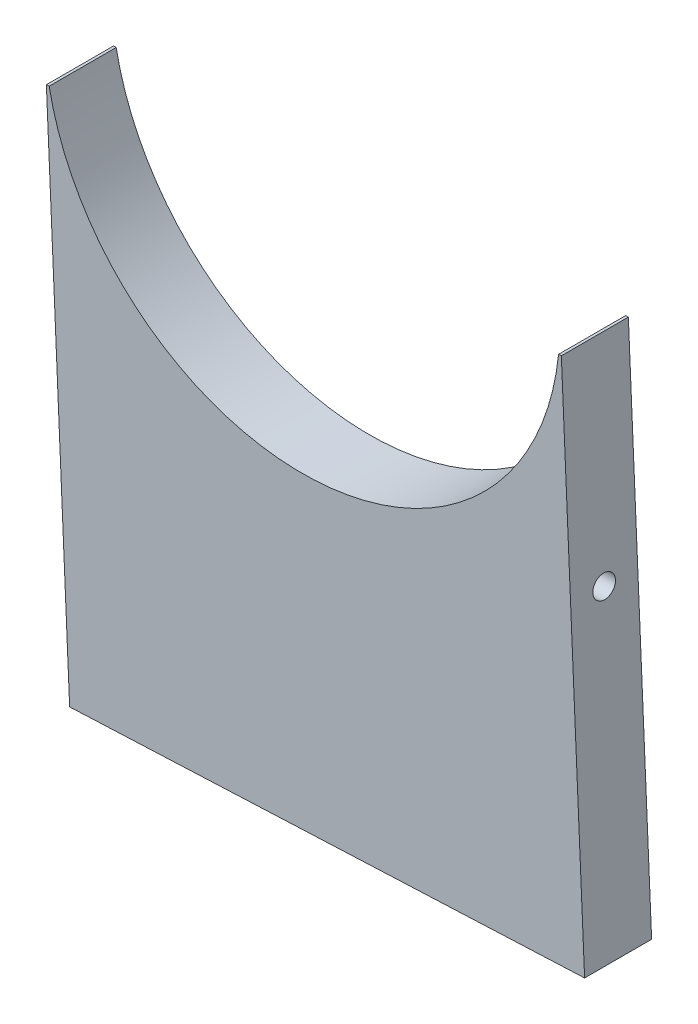
ISO-10303-21;
HEADER;
FILE_DESCRIPTION(('STEP AP214'),'2;1');
FILE_NAME('part.step','',(''),(''),'','','');
FILE_SCHEMA(('AUTOMOTIVE_DESIGN { 1 0 10303 214 1 1 1 1 }'));
ENDSEC;
DATA;
#1=APPLICATION_CONTEXT('core data for automotive mechanical design processes');
#2=APPLICATION_PROTOCOL_DEFINITION('international standard','automotive_design',2000,#1);
#3=PRODUCT_CONTEXT('',#1,'mechanical');
#4=PRODUCT('Part','Part','',(#3));
#5=PRODUCT_RELATED_PRODUCT_CATEGORY('part','',(#4));
#6=PRODUCT_DEFINITION_FORMATION('','',#4);
#7=PRODUCT_DEFINITION_CONTEXT('part definition',#1,'design');
#8=PRODUCT_DEFINITION('design','',#6,#7);
#9=PRODUCT_DEFINITION_SHAPE('','',#8);
#10=(LENGTH_UNIT() NAMED_UNIT(*) SI_UNIT(.MILLI.,.METRE.));
#11=(NAMED_UNIT(*) PLANE_ANGLE_UNIT() SI_UNIT($,.RADIAN.));
#12=(NAMED_UNIT(*) SI_UNIT($,.STERADIAN.) SOLID_ANGLE_UNIT());
#13=UNCERTAINTY_MEASURE_WITH_UNIT(LENGTH_MEASURE(1.E-05),#10,'distance_accuracy_value','');
#14=(GEOMETRIC_REPRESENTATION_CONTEXT(3) GLOBAL_UNCERTAINTY_ASSIGNED_CONTEXT((#13)) GLOBAL_UNIT_ASSIGNED_CONTEXT((#10,
#11,#12)) REPRESENTATION_CONTEXT('',''));
#15=CARTESIAN_POINT('',(0.,0.,0.));
#16=DIRECTION('',(0.,0.,1.));
#17=DIRECTION('',(1.,0.,0.));
#18=AXIS2_PLACEMENT_3D('',#15,#16,#17);
#19=CARTESIAN_POINT('',(-4.98980431580147,3.78601140373183,17.78));
#20=DIRECTION('',(0.,0.,-1.));
#21=DIRECTION('',(-1.,0.,0.));
#22=AXIS2_PLACEMENT_3D('',#19,#20,#21);
#23=CYLINDRICAL_SURFACE('',#22,68.3699999983781);
#24=CARTESIAN_POINT('',(-4.98980431580147,3.78601140373183,0.));
#25=DIRECTION('',(0.,0.,-1.));
#26=DIRECTION('',(1.,0.,0.));
#27=AXIS2_PLACEMENT_3D('',#24,#25,#26);
#28=CIRCLE('',#27,68.3699999983781);
#29=CARTESIAN_POINT('',(63.0199870242186,-3.22292444025703,0.));
#30=VERTEX_POINT('',#29);
#31=CARTESIAN_POINT('',(-72.1179941171461,-9.18561277263422,0.));
#32=VERTEX_POINT('',#31);
#33=EDGE_CURVE('E119',#30,#32,#28,.T.);
#34=ORIENTED_EDGE('',*,*,#33,.T.);
#35=DIRECTION('',(0.,0.,-1.));
#36=VECTOR('',#35,1.);
#37=CARTESIAN_POINT('',(-72.1179941171461,-9.18561277263422,17.78));
#38=LINE('',#37,#36);
#39=CARTESIAN_POINT('',(-72.1179941171461,-9.18561277263422,17.78));
#40=VERTEX_POINT('',#39);
#41=EDGE_CURVE('E11',#40,#32,#38,.T.);
#42=ORIENTED_EDGE('',*,*,#41,.F.);
#43=CARTESIAN_POINT('',(-4.98980431580147,3.78601140373183,17.78));
#44=DIRECTION('',(0.,0.,-1.));
#45=DIRECTION('',(1.,0.,0.));
#46=AXIS2_PLACEMENT_3D('',#43,#44,#45);
#47=CIRCLE('',#46,68.3699999983781);
#48=CARTESIAN_POINT('',(63.0199870242186,-3.22292444025703,17.78));
#49=VERTEX_POINT('',#48);
#50=EDGE_CURVE('E130',#49,#40,#47,.T.);
#51=ORIENTED_EDGE('',*,*,#50,.F.);
#52=DIRECTION('',(0.,0.,-1.));
#53=VECTOR('',#52,1.);
#54=CARTESIAN_POINT('',(63.0199870242186,-3.22292444025703,17.78));
#55=LINE('',#54,#53);
#56=EDGE_CURVE('E115',#49,#30,#55,.T.);
#57=ORIENTED_EDGE('',*,*,#56,.T.);
#58=EDGE_LOOP('',(#34,#42,#51,#57));
#59=FACE_BOUND('',#58,.T.);
#60=ADVANCED_FACE('F32',(#59),#23,.F.);
#61=CARTESIAN_POINT('',(-72.8525479744267,-9.21802346633644,17.78));
#62=DIRECTION('',(0.0440800769337757,-0.999028001017745,0.));
#63=DIRECTION('',(0.999028001017745,0.0440800769337758,0.));
#64=AXIS2_PLACEMENT_3D('',#61,#62,#63);
#65=PLANE('',#64);
#66=DIRECTION('',(-0.999028001017745,-0.0440800769337758,0.));
#67=VECTOR('',#66,1.);
#68=CARTESIAN_POINT('',(-72.8525479744267,-9.21802346633644,0.));
#69=LINE('',#68,#67);
#70=CARTESIAN_POINT('',(-72.8525479744267,-9.21802346633644,0.));
#71=VERTEX_POINT('',#70);
#72=EDGE_CURVE('E122',#32,#71,#69,.T.);
#73=ORIENTED_EDGE('',*,*,#72,.T.);
#74=DIRECTION('',(0.,0.,-1.));
#75=VECTOR('',#74,1.);
#76=CARTESIAN_POINT('',(-72.8525479744267,-9.21802346633644,17.78));
#77=LINE('',#76,#75);
#78=CARTESIAN_POINT('',(-72.8525479744267,-9.21802346633644,17.78));
#79=VERTEX_POINT('',#78);
#80=EDGE_CURVE('E40',#79,#71,#77,.T.);
#81=ORIENTED_EDGE('',*,*,#80,.F.);
#82=DIRECTION('',(-0.999028001017745,-0.0440800769337758,0.));
#83=VECTOR('',#82,1.);
#84=CARTESIAN_POINT('',(-72.8525479744267,-9.21802346633644,17.78));
#85=LINE('',#84,#83);
#86=EDGE_CURVE('E86',#40,#79,#85,.T.);
#87=ORIENTED_EDGE('',*,*,#86,.F.);
#88=ORIENTED_EDGE('',*,*,#41,.T.);
#89=EDGE_LOOP('',(#73,#81,#87,#88));
#90=FACE_BOUND('',#89,.T.);
#91=ADVANCED_FACE('F155',(#90),#65,.F.);
#92=CARTESIAN_POINT('',(-72.8525479744267,-9.21802346633644,17.78));
#93=DIRECTION('',(0.999028001017746,0.0440800769337766,0.));
#94=DIRECTION('',(-0.0440800769337766,0.999028001017745,0.));
#95=AXIS2_PLACEMENT_3D('',#92,#93,#94);
#96=PLANE('',#95);
#97=CARTESIAN_POINT('',(-70.373925555312,-65.3933610086481,8.89));
#98=DIRECTION('',(-0.999028001017745,-0.0440800769337766,0.));
#99=DIRECTION('',(0.0440800769337766,-0.999028001017745,0.));
#100=AXIS2_PLACEMENT_3D('',#97,#98,#99);
#101=CIRCLE('',#100,3.);
#102=CARTESIAN_POINT('',(-70.2416853245106,-68.3904450117014,8.89));
#103=VERTEX_POINT('',#102);
#104=EDGE_CURVE('E190',#103,#103,#101,.T.);
#105=ORIENTED_EDGE('',*,*,#104,.F.);
#106=EDGE_LOOP('',(#105));
#107=FACE_BOUND('',#106,.T.);
#108=DIRECTION('',(0.0440800769337766,-0.999028001017745,0.));
#109=VECTOR('',#108,1.);
#110=CARTESIAN_POINT('',(-72.8525479744267,-9.21802346633644,0.));
#111=LINE('',#110,#109);
#112=CARTESIAN_POINT('',(-66.6813372036979,-149.081943608821,0.));
#113=VERTEX_POINT('',#112);
#114=EDGE_CURVE('E125',#71,#113,#111,.T.);
#115=ORIENTED_EDGE('',*,*,#114,.T.);
#116=DIRECTION('',(0.,0.,-1.));
#117=VECTOR('',#116,1.);
#118=CARTESIAN_POINT('',(-66.6813372036979,-149.081943608821,17.78));
#119=LINE('',#118,#117);
#120=CARTESIAN_POINT('',(-66.6813372036979,-149.081943608821,17.78));
#121=VERTEX_POINT('',#120);
#122=EDGE_CURVE('E110',#121,#113,#119,.T.);
#123=ORIENTED_EDGE('',*,*,#122,.F.);
#124=DIRECTION('',(0.0440800769337766,-0.999028001017745,0.));
#125=VECTOR('',#124,1.);
#126=CARTESIAN_POINT('',(-72.8525479744267,-9.21802346633644,17.78));
#127=LINE('',#126,#125);
#128=EDGE_CURVE('E101',#79,#121,#127,.T.);
#129=ORIENTED_EDGE('',*,*,#128,.F.);
#130=ORIENTED_EDGE('',*,*,#80,.T.);
#131=EDGE_LOOP('',(#115,#123,#129,#130));
#132=FACE_BOUND('',#131,.T.);
#133=ADVANCED_FACE('F136',(#107,#132),#96,.F.);
#134=CARTESIAN_POINT('',(69.925751652228,-143.054433889039,17.78));
#135=DIRECTION('',(-0.0440800769337767,0.999028001017745,0.));
#136=DIRECTION('',(-0.999028001017745,-0.0440800769337767,0.));
#137=AXIS2_PLACEMENT_3D('',#134,#135,#136);
#138=PLANE('',#137);
#139=CARTESIAN_POINT('',(-32.5295649897165,-147.575066178875,8.89));
#140=DIRECTION('',(0.0440800769337767,-0.999028001017745,0.));
#141=DIRECTION('',(0.999028001017746,0.0440800769337767,0.));
#142=AXIS2_PLACEMENT_3D('',#139,#140,#141);
#143=CIRCLE('',#142,1.64999999999999);
#144=CARTESIAN_POINT('',(-30.8811687880372,-147.502334051935,8.89));
#145=VERTEX_POINT('',#144);
#146=EDGE_CURVE('E172',#145,#145,#143,.T.);
#147=ORIENTED_EDGE('',*,*,#146,.F.);
#148=EDGE_LOOP('',(#147));
#149=FACE_BOUND('',#148,.T.);
#150=CARTESIAN_POINT('',(35.7739794382465,-144.561311318985,8.89));
#151=DIRECTION('',(0.0440800769337767,-0.999028001017745,0.));
#152=DIRECTION('',(0.999028001017746,0.0440800769337767,0.));
#153=AXIS2_PLACEMENT_3D('',#150,#151,#152);
#154=CIRCLE('',#153,1.64999999999999);
#155=CARTESIAN_POINT('',(37.4223756399258,-144.488579192044,8.89));
#156=VERTEX_POINT('',#155);
#157=EDGE_CURVE('E175',#156,#156,#154,.T.);
#158=ORIENTED_EDGE('',*,*,#157,.F.);
#159=EDGE_LOOP('',(#158));
#160=FACE_BOUND('',#159,.T.);
#161=DIRECTION('',(0.999028001017745,0.0440800769337767,0.));
#162=VECTOR('',#161,1.);
#163=CARTESIAN_POINT('',(69.925751652228,-143.054433889039,0.));
#164=LINE('',#163,#162);
#165=CARTESIAN_POINT('',(69.925751652228,-143.054433889039,0.));
#166=VERTEX_POINT('',#165);
#167=EDGE_CURVE('E109',#113,#166,#164,.T.);
#168=ORIENTED_EDGE('',*,*,#167,.T.);
#169=DIRECTION('',(0.,0.,-1.));
#170=VECTOR('',#169,1.);
#171=CARTESIAN_POINT('',(69.925751652228,-143.054433889039,17.78));
#172=LINE('',#171,#170);
#173=CARTESIAN_POINT('',(69.925751652228,-143.054433889039,17.78));
#174=VERTEX_POINT('',#173);
#175=EDGE_CURVE('E106',#174,#166,#172,.T.);
#176=ORIENTED_EDGE('',*,*,#175,.F.);
#177=DIRECTION('',(0.999028001017745,0.0440800769337767,0.));
#178=VECTOR('',#177,1.);
#179=CARTESIAN_POINT('',(69.925751652228,-143.054433889039,17.78));
#180=LINE('',#179,#178);
#181=EDGE_CURVE('E95',#121,#174,#180,.T.);
#182=ORIENTED_EDGE('',*,*,#181,.F.);
#183=ORIENTED_EDGE('',*,*,#122,.T.);
#184=EDGE_LOOP('',(#168,#176,#182,#183));
#185=FACE_BOUND('',#184,.T.);
#186=ADVANCED_FACE('F107',(#149,#160,#185),#138,.F.);
#187=CARTESIAN_POINT('',(63.7545408814993,-3.1905137465548,17.78));
#188=DIRECTION('',(-0.999028001017746,-0.0440800769337766,0.));
#189=DIRECTION('',(0.0440800769337766,-0.999028001017745,0.));
#190=AXIS2_PLACEMENT_3D('',#187,#188,#189);
#191=PLANE('',#190);
#192=CARTESIAN_POINT('',(66.2331633006141,-59.3658512888664,8.89));
#193=DIRECTION('',(0.999028001017745,0.0440800769337766,0.));
#194=DIRECTION('',(-0.0440800769337766,0.999028001017745,0.));
#195=AXIS2_PLACEMENT_3D('',#192,#193,#194);
#196=CIRCLE('',#195,3.);
#197=CARTESIAN_POINT('',(66.1009230698127,-56.3687672858132,8.89));
#198=VERTEX_POINT('',#197);
#199=EDGE_CURVE('E181',#198,#198,#196,.T.);
#200=ORIENTED_EDGE('',*,*,#199,.F.);
#201=EDGE_LOOP('',(#200));
#202=FACE_BOUND('',#201,.T.);
#203=DIRECTION('',(-0.0440800769337766,0.999028001017745,0.));
#204=VECTOR('',#203,1.);
#205=CARTESIAN_POINT('',(63.7545408814993,-3.1905137465548,0.));
#206=LINE('',#205,#204);
#207=CARTESIAN_POINT('',(63.7545408814993,-3.1905137465548,0.));
#208=VERTEX_POINT('',#207);
#209=EDGE_CURVE('E72',#166,#208,#206,.T.);
#210=ORIENTED_EDGE('',*,*,#209,.T.);
#211=DIRECTION('',(0.,0.,-1.));
#212=VECTOR('',#211,1.);
#213=CARTESIAN_POINT('',(63.7545408814993,-3.1905137465548,17.78));
#214=LINE('',#213,#212);
#215=CARTESIAN_POINT('',(63.7545408814993,-3.1905137465548,17.78));
#216=VERTEX_POINT('',#215);
#217=EDGE_CURVE('E111',#216,#208,#214,.T.);
#218=ORIENTED_EDGE('',*,*,#217,.F.);
#219=DIRECTION('',(-0.0440800769337766,0.999028001017745,0.));
#220=VECTOR('',#219,1.);
#221=CARTESIAN_POINT('',(63.7545408814993,-3.1905137465548,17.78));
#222=LINE('',#221,#220);
#223=EDGE_CURVE('E99',#174,#216,#222,.T.);
#224=ORIENTED_EDGE('',*,*,#223,.F.);
#225=ORIENTED_EDGE('',*,*,#175,.T.);
#226=EDGE_LOOP('',(#210,#218,#224,#225));
#227=FACE_BOUND('',#226,.T.);
#228=ADVANCED_FACE('F113',(#202,#227),#191,.F.);
#229=CARTESIAN_POINT('',(63.0199870242186,-3.22292444025703,17.78));
#230=DIRECTION('',(0.0440800769337769,-0.999028001017746,0.));
#231=DIRECTION('',(0.999028001017745,0.0440800769337769,0.));
#232=AXIS2_PLACEMENT_3D('',#229,#230,#231);
#233=PLANE('',#232);
#234=DIRECTION('',(-0.999028001017745,-0.0440800769337769,0.));
#235=VECTOR('',#234,1.);
#236=CARTESIAN_POINT('',(63.0199870242186,-3.22292444025703,0.));
#237=LINE('',#236,#235);
#238=EDGE_CURVE('E78',#208,#30,#237,.T.);
#239=ORIENTED_EDGE('',*,*,#238,.T.);
#240=ORIENTED_EDGE('',*,*,#56,.F.);
#241=DIRECTION('',(-0.999028001017745,-0.0440800769337769,0.));
#242=VECTOR('',#241,1.);
#243=CARTESIAN_POINT('',(63.0199870242186,-3.22292444025703,17.78));
#244=LINE('',#243,#242);
#245=EDGE_CURVE('E48',#216,#49,#244,.T.);
#246=ORIENTED_EDGE('',*,*,#245,.F.);
#247=ORIENTED_EDGE('',*,*,#217,.T.);
#248=EDGE_LOOP('',(#239,#240,#246,#247));
#249=FACE_BOUND('',#248,.T.);
#250=ADVANCED_FACE('F143',(#249),#233,.F.);
#251=CARTESIAN_POINT('',(-4.98980431580147,3.78601140373183,17.78));
#252=DIRECTION('',(0.,0.,1.));
#253=DIRECTION('',(1.,0.,0.));
#254=AXIS2_PLACEMENT_3D('',#251,#252,#253);
#255=PLANE('',#254);
#256=ORIENTED_EDGE('',*,*,#50,.T.);
#257=ORIENTED_EDGE('',*,*,#86,.T.);
#258=ORIENTED_EDGE('',*,*,#128,.T.);
#259=ORIENTED_EDGE('',*,*,#181,.T.);
#260=ORIENTED_EDGE('',*,*,#223,.T.);
#261=ORIENTED_EDGE('',*,*,#245,.T.);
#262=EDGE_LOOP('',(#256,#257,#258,#259,#260,#261));
#263=FACE_BOUND('',#262,.T.);
#264=ADVANCED_FACE('F97',(#263),#255,.T.);
#265=CARTESIAN_POINT('',(-4.98980431580147,3.78601140373183,0.));
#266=DIRECTION('',(0.,0.,1.));
#267=DIRECTION('',(1.,0.,0.));
#268=AXIS2_PLACEMENT_3D('',#265,#266,#267);
#269=PLANE('',#268);
#270=ORIENTED_EDGE('',*,*,#33,.F.);
#271=ORIENTED_EDGE('',*,*,#238,.F.);
#272=ORIENTED_EDGE('',*,*,#209,.F.);
#273=ORIENTED_EDGE('',*,*,#167,.F.);
#274=ORIENTED_EDGE('',*,*,#114,.F.);
#275=ORIENTED_EDGE('',*,*,#72,.F.);
#276=EDGE_LOOP('',(#270,#271,#272,#273,#274,#275));
#277=FACE_BOUND('',#276,.T.);
#278=ADVANCED_FACE('F139',(#277),#269,.F.);
#279=CARTESIAN_POINT('',(-64.3797575492055,-65.1288805470455,8.89));
#280=DIRECTION('',(-0.999028001017745,-0.0440800769337766,0.));
#281=DIRECTION('',(0.0440800769337766,-0.999028001017746,0.));
#282=AXIS2_PLACEMENT_3D('',#279,#280,#281);
#283=CYLINDRICAL_SURFACE('',#282,3.);
#284=CARTESIAN_POINT('',(-64.3797575492055,-65.1288805470455,8.89));
#285=DIRECTION('',(-0.999028001017745,-0.0440800769337766,0.));
#286=DIRECTION('',(0.0440800769337766,-0.999028001017745,0.));
#287=AXIS2_PLACEMENT_3D('',#284,#285,#286);
#288=CIRCLE('',#287,3.);
#289=CARTESIAN_POINT('',(-64.2475173184041,-68.1259645500987,8.89));
#290=VERTEX_POINT('',#289);
#291=EDGE_CURVE('E123',#290,#290,#288,.T.);
#292=ORIENTED_EDGE('',*,*,#291,.F.);
#293=EDGE_LOOP('',(#292));
#294=FACE_BOUND('',#293,.T.);
#295=ORIENTED_EDGE('',*,*,#104,.T.);
#296=EDGE_LOOP('',(#295));
#297=FACE_BOUND('',#296,.T.);
#298=ADVANCED_FACE('F200',(#294,#297),#283,.F.);
#299=CARTESIAN_POINT('',(-64.3797575492055,-65.1288805470455,8.89));
#300=DIRECTION('',(-0.999028001017745,-0.0440800769337766,0.));
#301=DIRECTION('',(0.0440800769337766,-0.999028001017745,0.));
#302=AXIS2_PLACEMENT_3D('',#299,#300,#301);
#303=PLANE('',#302);
#304=ORIENTED_EDGE('',*,*,#291,.T.);
#305=EDGE_LOOP('',(#304));
#306=FACE_BOUND('',#305,.T.);
#307=ADVANCED_FACE('F202',(#306),#303,.T.);
#308=CARTESIAN_POINT('',(60.2389952945076,-59.6303317504691,8.89));
#309=DIRECTION('',(0.999028001017745,0.0440800769337766,0.));
#310=DIRECTION('',(-0.0440800769337766,0.999028001017746,0.));
#311=AXIS2_PLACEMENT_3D('',#308,#309,#310);
#312=CYLINDRICAL_SURFACE('',#311,3.);
#313=CARTESIAN_POINT('',(60.2389952945076,-59.6303317504691,8.89));
#314=DIRECTION('',(0.999028001017745,0.0440800769337766,0.));
#315=DIRECTION('',(-0.0440800769337766,0.999028001017745,0.));
#316=AXIS2_PLACEMENT_3D('',#313,#314,#315);
#317=CIRCLE('',#316,3.);
#318=CARTESIAN_POINT('',(60.1067550637062,-56.6332477474158,8.89));
#319=VERTEX_POINT('',#318);
#320=EDGE_CURVE('E187',#319,#319,#317,.T.);
#321=ORIENTED_EDGE('',*,*,#320,.F.);
#322=EDGE_LOOP('',(#321));
#323=FACE_BOUND('',#322,.T.);
#324=ORIENTED_EDGE('',*,*,#199,.T.);
#325=EDGE_LOOP('',(#324));
#326=FACE_BOUND('',#325,.T.);
#327=ADVANCED_FACE('F209',(#323,#326),#312,.F.);
#328=CARTESIAN_POINT('',(60.2389952945076,-59.6303317504691,8.89));
#329=DIRECTION('',(0.999028001017745,0.0440800769337766,0.));
#330=DIRECTION('',(-0.0440800769337766,0.999028001017745,0.));
#331=AXIS2_PLACEMENT_3D('',#328,#329,#330);
#332=PLANE('',#331);
#333=ORIENTED_EDGE('',*,*,#320,.T.);
#334=EDGE_LOOP('',(#333));
#335=FACE_BOUND('',#334,.T.);
#336=ADVANCED_FACE('F216',(#335),#332,.T.);
#337=CARTESIAN_POINT('',(35.3331786689088,-134.571031308807,8.89));
#338=DIRECTION('',(0.0440800769337767,-0.999028001017745,0.));
#339=DIRECTION('',(0.999028001017746,0.0440800769337767,0.));
#340=AXIS2_PLACEMENT_3D('',#337,#338,#339);
#341=CONICAL_SURFACE('',#340,1.64999999999999,1.02974425867666);
#342=CARTESIAN_POINT('',(35.289476798092,-133.580574946663,8.89));
#343=VERTEX_POINT('',#342);
#344=VERTEX_LOOP('',#343);
#345=FACE_BOUND('',#344,.T.);
#346=CARTESIAN_POINT('',(35.3331786689088,-134.571031308807,8.89));
#347=DIRECTION('',(0.0440800769337767,-0.999028001017745,0.));
#348=DIRECTION('',(0.999028001017746,0.0440800769337767,0.));
#349=AXIS2_PLACEMENT_3D('',#346,#347,#348);
#350=CIRCLE('',#349,1.64999999999999);
#351=CARTESIAN_POINT('',(36.981574870588,-134.498299181866,8.89));
#352=VERTEX_POINT('',#351);
#353=EDGE_CURVE('E177',#352,#352,#350,.T.);
#354=ORIENTED_EDGE('',*,*,#353,.T.);
#355=EDGE_LOOP('',(#354));
#356=FACE_BOUND('',#355,.T.);
#357=ADVANCED_FACE('F220',(#345,#356),#341,.F.);
#358=CARTESIAN_POINT('',(35.7739794382465,-144.561311318985,8.89));
#359=DIRECTION('',(0.0440800769337767,-0.999028001017745,0.));
#360=DIRECTION('',(0.999028001017746,0.0440800769337767,0.));
#361=AXIS2_PLACEMENT_3D('',#358,#359,#360);
#362=CYLINDRICAL_SURFACE('',#361,1.64999999999999);
#363=CARTESIAN_POINT('',(36.981574870588,-134.498299181866,8.89));
#364=CARTESIAN_POINT('',(36.9861665452686,-134.602364598639,8.89));
#365=CARTESIAN_POINT('',(36.9907582199492,-134.706430015412,8.89));
#366=CARTESIAN_POINT('',(36.9999415693104,-134.914560848957,8.89));
#367=CARTESIAN_POINT('',(37.004533243991,-135.01862626573,8.89));
#368=CARTESIAN_POINT('',(37.0137165933522,-135.226757099275,8.89));
#369=CARTESIAN_POINT('',(37.0183082680328,-135.330822516048,8.89));
#370=CARTESIAN_POINT('',(37.027491617394,-135.538953349593,8.89));
#371=CARTESIAN_POINT('',(37.0320832920746,-135.643018766366,8.89));
#372=CARTESIAN_POINT('',(37.0412666414358,-135.851149599911,8.89));
#373=CARTESIAN_POINT('',(37.0458583161164,-135.955215016684,8.89));
#374=CARTESIAN_POINT('',(37.0550416654776,-136.163345850229,8.89));
#375=CARTESIAN_POINT('',(37.0596333401582,-136.267411267002,8.89));
#376=CARTESIAN_POINT('',(37.0688166895195,-136.475542100547,8.89));
#377=CARTESIAN_POINT('',(37.0734083642001,-136.57960751732,8.89));
#378=CARTESIAN_POINT('',(37.0825917135613,-136.787738350865,8.89));
#379=CARTESIAN_POINT('',(37.0871833882419,-136.891803767638,8.89));
#380=CARTESIAN_POINT('',(37.0963667376031,-137.099934601183,8.89));
#381=CARTESIAN_POINT('',(37.1009584122837,-137.204000017956,8.89));
#382=CARTESIAN_POINT('',(37.1101417616449,-137.412130851501,8.89));
#383=CARTESIAN_POINT('',(37.1147334363255,-137.516196268274,8.89));
#384=CARTESIAN_POINT('',(37.1239167856867,-137.72432710182,8.89));
#385=CARTESIAN_POINT('',(37.1285084603673,-137.828392518592,8.89));
#386=CARTESIAN_POINT('',(37.1376918097285,-138.036523352138,8.89));
#387=CARTESIAN_POINT('',(37.1422834844091,-138.14058876891,8.89));
#388=CARTESIAN_POINT('',(37.1514668337703,-138.348719602456,8.89));
#389=CARTESIAN_POINT('',(37.1560585084509,-138.452785019228,8.89));
#390=CARTESIAN_POINT('',(37.1652418578121,-138.660915852774,8.89));
#391=CARTESIAN_POINT('',(37.1698335324927,-138.764981269546,8.89));
#392=CARTESIAN_POINT('',(37.1790168818539,-138.973112103092,8.89));
#393=CARTESIAN_POINT('',(37.1836085565345,-139.077177519864,8.89));
#394=CARTESIAN_POINT('',(37.1927919058957,-139.28530835341,8.89));
#395=CARTESIAN_POINT('',(37.1973835805763,-139.389373770182,8.89));
#396=CARTESIAN_POINT('',(37.2065669299375,-139.597504603728,8.89));
#397=CARTESIAN_POINT('',(37.2111586046181,-139.7015700205,8.89));
#398=CARTESIAN_POINT('',(37.2203419539793,-139.909700854046,8.89));
#399=CARTESIAN_POINT('',(37.2249336286599,-140.013766270819,8.89));
#400=CARTESIAN_POINT('',(37.2341169780211,-140.221897104364,8.89));
#401=CARTESIAN_POINT('',(37.2387086527017,-140.325962521137,8.89));
#402=CARTESIAN_POINT('',(37.2478920020629,-140.534093354682,8.89));
#403=CARTESIAN_POINT('',(37.2524836767435,-140.638158771455,8.89));
#404=CARTESIAN_POINT('',(37.2616670261047,-140.846289605,8.89));
#405=CARTESIAN_POINT('',(37.2662587007853,-140.950355021773,8.89));
#406=CARTESIAN_POINT('',(37.2754420501465,-141.158485855318,8.89));
#407=CARTESIAN_POINT('',(37.2800337248271,-141.262551272091,8.89));
#408=CARTESIAN_POINT('',(37.2892170741883,-141.470682105636,8.89));
#409=CARTESIAN_POINT('',(37.2938087488689,-141.574747522409,8.89));
#410=CARTESIAN_POINT('',(37.3029920982301,-141.782878355954,8.89));
#411=CARTESIAN_POINT('',(37.3075837729107,-141.886943772727,8.89));
#412=CARTESIAN_POINT('',(37.3167671222719,-142.095074606272,8.89));
#413=CARTESIAN_POINT('',(37.3213587969526,-142.199140023045,8.89));
#414=CARTESIAN_POINT('',(37.3305421463138,-142.40727085659,8.89));
#415=CARTESIAN_POINT('',(37.3351338209944,-142.511336273363,8.89));
#416=CARTESIAN_POINT('',(37.3443171703556,-142.719467106908,8.89));
#417=CARTESIAN_POINT('',(37.3489088450362,-142.823532523681,8.89));
#418=CARTESIAN_POINT('',(37.3580921943974,-143.031663357226,8.89));
#419=CARTESIAN_POINT('',(37.362683869078,-143.135728773999,8.89));
#420=CARTESIAN_POINT('',(37.3718672184392,-143.343859607544,8.89));
#421=CARTESIAN_POINT('',(37.3764588931198,-143.447925024317,8.89));
#422=CARTESIAN_POINT('',(37.385642242481,-143.656055857862,8.89));
#423=CARTESIAN_POINT('',(37.3902339171616,-143.760121274635,8.89));
#424=CARTESIAN_POINT('',(37.3994172665228,-143.96825210818,8.89));
#425=CARTESIAN_POINT('',(37.4040089412034,-144.072317524953,8.89));
#426=CARTESIAN_POINT('',(37.4131922905646,-144.280448358498,8.89));
#427=CARTESIAN_POINT('',(37.4177839652452,-144.384513775271,8.89));
#428=CARTESIAN_POINT('',(37.4223756399258,-144.488579192044,8.89));
#429=B_SPLINE_CURVE_WITH_KNOTS('',3,(#363,#364,#365,#366,#367,#368,#369,#370,#371,#372,#373,
#374,#375,#376,#377,#378,#379,#380,#381,#382,#383,#384,#385,#386,#387,#388,#389,#390,#391,#392,
#393,#394,#395,#396,#397,#398,#399,#400,#401,#402,#403,#404,#405,#406,#407,#408,#409,#410,#411,
#412,#413,#414,#415,#416,#417,#418,#419,#420,#421,#422,#423,#424,#425,#426,#427,#428),
.UNSPECIFIED.,.F.,.F.,(4,2,2,2,2,2,2,2,2,2,2,2,2,2,2,2,2,2,2,2,2,2,2,2,2,2,2,2,2,2,2,2,4),(0.,
0.312500000000013,0.624999999999998,0.937500000000012,1.25000000000002,1.56250000000001,
1.87500000000002,2.18750000000001,2.50000000000002,2.81250000000001,3.12500000000002,
3.43750000000001,3.75000000000002,4.06250000000001,4.37500000000002,4.6875,5.00000000000002,
5.3125,5.62500000000002,5.93750000000003,6.25000000000002,6.56250000000003,6.87500000000001,
7.18750000000003,7.50000000000001,7.81250000000003,8.12500000000001,8.43750000000002,
8.75000000000001,9.06250000000002,9.37500000000001,9.68750000000002,10.),.UNSPECIFIED.);
#430=EDGE_CURVE('BSEAM224',#352,#156,#429,.T.);
#431=ORIENTED_EDGE('',*,*,#353,.F.);
#432=ORIENTED_EDGE('',*,*,#157,.T.);
#433=ORIENTED_EDGE('',*,*,#430,.T.);
#434=ORIENTED_EDGE('',*,*,#430,.F.);
#435=EDGE_LOOP('',(#431,#433,#432,#434));
#436=FACE_BOUND('',#435,.T.);
#437=ADVANCED_FACE('F224',(#436),#362,.F.);
#438=CARTESIAN_POINT('',(-32.9703657590542,-137.584786168698,8.89));
#439=DIRECTION('',(0.0440800769337767,-0.999028001017745,0.));
#440=DIRECTION('',(0.999028001017746,0.0440800769337767,0.));
#441=AXIS2_PLACEMENT_3D('',#438,#439,#440);
#442=CONICAL_SURFACE('',#441,1.64999999999999,1.02974425867666);
#443=CARTESIAN_POINT('',(-33.014067629871,-136.594329806554,8.89));
#444=VERTEX_POINT('',#443);
#445=VERTEX_LOOP('',#444);
#446=FACE_BOUND('',#445,.T.);
#447=CARTESIAN_POINT('',(-32.9703657590542,-137.584786168698,8.89));
#448=DIRECTION('',(0.0440800769337767,-0.999028001017745,0.));
#449=DIRECTION('',(0.999028001017746,0.0440800769337767,0.));
#450=AXIS2_PLACEMENT_3D('',#447,#448,#449);
#451=CIRCLE('',#450,1.64999999999999);
#452=CARTESIAN_POINT('',(-31.321969557375,-137.512054041757,8.89));
#453=VERTEX_POINT('',#452);
#454=EDGE_CURVE('E178',#453,#453,#451,.T.);
#455=ORIENTED_EDGE('',*,*,#454,.T.);
#456=EDGE_LOOP('',(#455));
#457=FACE_BOUND('',#456,.T.);
#458=ADVANCED_FACE('F228',(#446,#457),#442,.F.);
#459=CARTESIAN_POINT('',(-32.5295649897165,-147.575066178875,8.89));
#460=DIRECTION('',(0.0440800769337767,-0.999028001017745,0.));
#461=DIRECTION('',(0.999028001017746,0.0440800769337767,0.));
#462=AXIS2_PLACEMENT_3D('',#459,#460,#461);
#463=CYLINDRICAL_SURFACE('',#462,1.64999999999999);
#464=CARTESIAN_POINT('',(-31.321969557375,-137.512054041757,8.89));
#465=CARTESIAN_POINT('',(-31.3173778826944,-137.61611945853,8.89));
#466=CARTESIAN_POINT('',(-31.3127862080138,-137.720184875303,8.89));
#467=CARTESIAN_POINT('',(-31.3036028586526,-137.928315708848,8.89));
#468=CARTESIAN_POINT('',(-31.2990111839719,-138.032381125621,8.89));
#469=CARTESIAN_POINT('',(-31.2898278346107,-138.240511959166,8.89));
#470=CARTESIAN_POINT('',(-31.2852361599301,-138.344577375939,8.89));
#471=CARTESIAN_POINT('',(-31.2760528105689,-138.552708209484,8.89));
#472=CARTESIAN_POINT('',(-31.2714611358883,-138.656773626257,8.89));
#473=CARTESIAN_POINT('',(-31.2622777865271,-138.864904459802,8.89));
#474=CARTESIAN_POINT('',(-31.2576861118465,-138.968969876575,8.89));
#475=CARTESIAN_POINT('',(-31.2485027624853,-139.17710071012,8.89));
#476=CARTESIAN_POINT('',(-31.2439110878047,-139.281166126893,8.89));
#477=CARTESIAN_POINT('',(-31.2347277384435,-139.489296960438,8.89));
#478=CARTESIAN_POINT('',(-31.2301360637629,-139.593362377211,8.89));
#479=CARTESIAN_POINT('',(-31.2209527144017,-139.801493210756,8.89));
#480=CARTESIAN_POINT('',(-31.2163610397211,-139.905558627529,8.89));
#481=CARTESIAN_POINT('',(-31.2071776903599,-140.113689461074,8.89));
#482=CARTESIAN_POINT('',(-31.2025860156793,-140.217754877847,8.89));
#483=CARTESIAN_POINT('',(-31.1934026663181,-140.425885711392,8.89));
#484=CARTESIAN_POINT('',(-31.1888109916375,-140.529951128165,8.89));
#485=CARTESIAN_POINT('',(-31.1796276422763,-140.73808196171,8.89));
#486=CARTESIAN_POINT('',(-31.1750359675957,-140.842147378483,8.89));
#487=CARTESIAN_POINT('',(-31.1658526182345,-141.050278212028,8.89));
#488=CARTESIAN_POINT('',(-31.1612609435539,-141.154343628801,8.89));
#489=CARTESIAN_POINT('',(-31.1520775941927,-141.362474462346,8.89));
#490=CARTESIAN_POINT('',(-31.1474859195121,-141.466539879119,8.89));
#491=CARTESIAN_POINT('',(-31.1383025701509,-141.674670712664,8.89));
#492=CARTESIAN_POINT('',(-31.1337108954703,-141.778736129437,8.89));
#493=CARTESIAN_POINT('',(-31.1245275461091,-141.986866962983,8.89));
#494=CARTESIAN_POINT('',(-31.1199358714285,-142.090932379755,8.89));
#495=CARTESIAN_POINT('',(-31.1107525220673,-142.299063213301,8.89));
#496=CARTESIAN_POINT('',(-31.1061608473867,-142.403128630073,8.89));
#497=CARTESIAN_POINT('',(-31.0969774980255,-142.611259463619,8.89));
#498=CARTESIAN_POINT('',(-31.0923858233449,-142.715324880391,8.89));
#499=CARTESIAN_POINT('',(-31.0832024739837,-142.923455713937,8.89));
#500=CARTESIAN_POINT('',(-31.0786107993031,-143.027521130709,8.89));
#501=CARTESIAN_POINT('',(-31.0694274499419,-143.235651964255,8.89));
#502=CARTESIAN_POINT('',(-31.0648357752613,-143.339717381027,8.89));
#503=CARTESIAN_POINT('',(-31.0556524259001,-143.547848214573,8.89));
#504=CARTESIAN_POINT('',(-31.0510607512195,-143.651913631345,8.89));
#505=CARTESIAN_POINT('',(-31.0418774018583,-143.860044464891,8.89));
#506=CARTESIAN_POINT('',(-31.0372857271777,-143.964109881663,8.89));
#507=CARTESIAN_POINT('',(-31.0281023778164,-144.172240715209,8.89));
#508=CARTESIAN_POINT('',(-31.0235107031358,-144.276306131982,8.89));
#509=CARTESIAN_POINT('',(-31.0143273537746,-144.484436965527,8.89));
#510=CARTESIAN_POINT('',(-31.009735679094,-144.5885023823,8.89));
#511=CARTESIAN_POINT('',(-31.0005523297328,-144.796633215845,8.89));
#512=CARTESIAN_POINT('',(-30.9959606550522,-144.900698632618,8.89));
#513=CARTESIAN_POINT('',(-30.986777305691,-145.108829466163,8.89));
#514=CARTESIAN_POINT('',(-30.9821856310104,-145.212894882936,8.89));
#515=CARTESIAN_POINT('',(-30.9730022816492,-145.421025716481,8.89));
#516=CARTESIAN_POINT('',(-30.9684106069686,-145.525091133254,8.89));
#517=CARTESIAN_POINT('',(-30.9592272576074,-145.733221966799,8.89));
#518=CARTESIAN_POINT('',(-30.9546355829268,-145.837287383572,8.89));
#519=CARTESIAN_POINT('',(-30.9454522335656,-146.045418217117,8.89));
#520=CARTESIAN_POINT('',(-30.940860558885,-146.14948363389,8.89));
#521=CARTESIAN_POINT('',(-30.9316772095238,-146.357614467435,8.89));
#522=CARTESIAN_POINT('',(-30.9270855348432,-146.461679884208,8.89));
#523=CARTESIAN_POINT('',(-30.917902185482,-146.669810717753,8.89));
#524=CARTESIAN_POINT('',(-30.9133105108014,-146.773876134526,8.89));
#525=CARTESIAN_POINT('',(-30.9041271614402,-146.982006968071,8.89));
#526=CARTESIAN_POINT('',(-30.8995354867596,-147.086072384844,8.89));
#527=CARTESIAN_POINT('',(-30.8903521373984,-147.294203218389,8.89));
#528=CARTESIAN_POINT('',(-30.8857604627178,-147.398268635162,8.89));
#529=CARTESIAN_POINT('',(-30.8811687880372,-147.502334051935,8.89));
#530=B_SPLINE_CURVE_WITH_KNOTS('',3,(#464,#465,#466,#467,#468,#469,#470,#471,#472,#473,#474,
#475,#476,#477,#478,#479,#480,#481,#482,#483,#484,#485,#486,#487,#488,#489,#490,#491,#492,#493,
#494,#495,#496,#497,#498,#499,#500,#501,#502,#503,#504,#505,#506,#507,#508,#509,#510,#511,#512,
#513,#514,#515,#516,#517,#518,#519,#520,#521,#522,#523,#524,#525,#526,#527,#528,#529),
.UNSPECIFIED.,.F.,.F.,(4,2,2,2,2,2,2,2,2,2,2,2,2,2,2,2,2,2,2,2,2,2,2,2,2,2,2,2,2,2,2,2,4),(0.,
0.312499999999985,0.624999999999998,0.937499999999984,1.25,1.56249999999998,1.875,
2.18749999999998,2.49999999999999,2.81249999999998,3.12499999999999,3.43749999999998,
3.74999999999999,4.06249999999998,4.37499999999999,4.68749999999998,4.99999999999999,5.3125,
5.62499999999999,5.9375,6.24999999999999,6.5625,6.87499999999999,7.1875,7.49999999999998,7.8125,
8.12499999999998,8.4375,8.74999999999998,9.06249999999999,9.37499999999998,9.68749999999999,
10.),.UNSPECIFIED.);
#531=EDGE_CURVE('BSEAM232',#453,#145,#530,.T.);
#532=ORIENTED_EDGE('',*,*,#454,.F.);
#533=ORIENTED_EDGE('',*,*,#146,.T.);
#534=ORIENTED_EDGE('',*,*,#531,.T.);
#535=ORIENTED_EDGE('',*,*,#531,.F.);
#536=EDGE_LOOP('',(#532,#534,#533,#535));
#537=FACE_BOUND('',#536,.T.);
#538=ADVANCED_FACE('F232',(#537),#463,.F.);
#539=CLOSED_SHELL('',(#60,#91,#133,#186,#228,#250,#264,#278,#298,#307,#327,#336,#357,#437,#458,#538));
#540=MANIFOLD_SOLID_BREP('B2',#539);
#541=ADVANCED_BREP_SHAPE_REPRESENTATION('',(#18,#540),#14);
#542=SHAPE_DEFINITION_REPRESENTATION(#9,#541);
ENDSEC;
END-ISO-10303-21;
